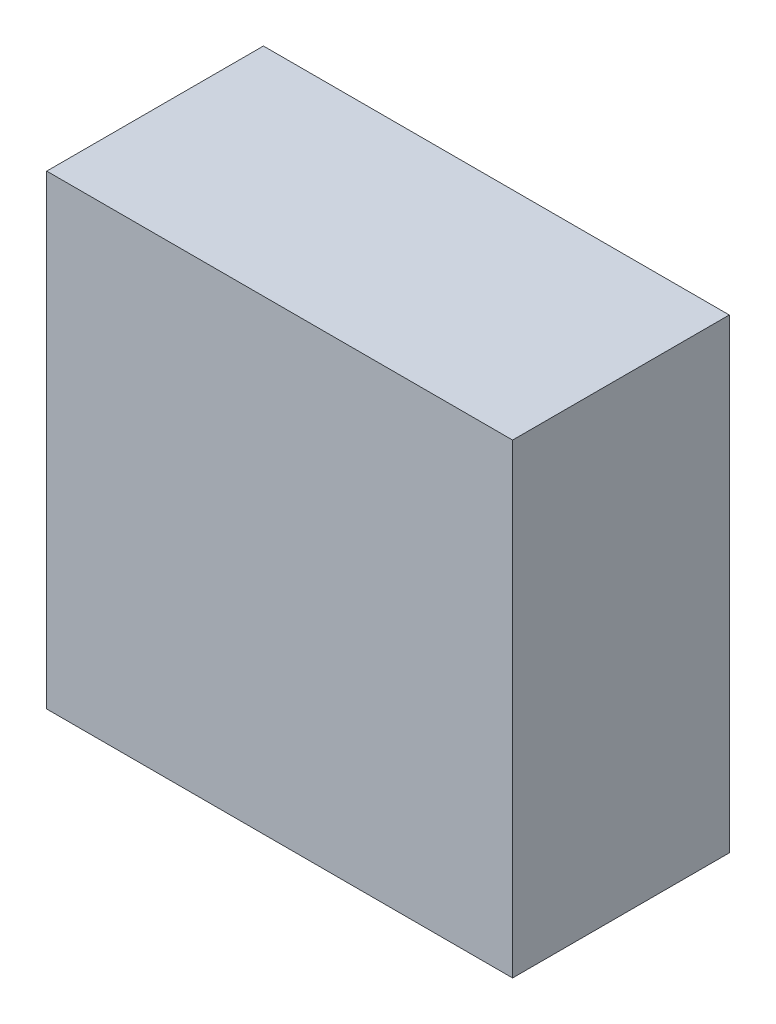
ISO-10303-21;
HEADER;
FILE_DESCRIPTION(('STEP AP214'),'2;1');
FILE_NAME('part.step','',(''),(''),'','','');
FILE_SCHEMA(('AUTOMOTIVE_DESIGN { 1 0 10303 214 1 1 1 1 }'));
ENDSEC;
DATA;
#1=APPLICATION_CONTEXT('core data for automotive mechanical design processes');
#2=APPLICATION_PROTOCOL_DEFINITION('international standard','automotive_design',2000,#1);
#3=PRODUCT_CONTEXT('',#1,'mechanical');
#4=PRODUCT('Part','Part','',(#3));
#5=PRODUCT_RELATED_PRODUCT_CATEGORY('part','',(#4));
#6=PRODUCT_DEFINITION_FORMATION('','',#4);
#7=PRODUCT_DEFINITION_CONTEXT('part definition',#1,'design');
#8=PRODUCT_DEFINITION('design','',#6,#7);
#9=PRODUCT_DEFINITION_SHAPE('','',#8);
#10=(LENGTH_UNIT() NAMED_UNIT(*) SI_UNIT(.MILLI.,.METRE.));
#11=(NAMED_UNIT(*) PLANE_ANGLE_UNIT() SI_UNIT($,.RADIAN.));
#12=(NAMED_UNIT(*) SI_UNIT($,.STERADIAN.) SOLID_ANGLE_UNIT());
#13=UNCERTAINTY_MEASURE_WITH_UNIT(LENGTH_MEASURE(1.E-05),#10,'distance_accuracy_value','');
#14=(GEOMETRIC_REPRESENTATION_CONTEXT(3) GLOBAL_UNCERTAINTY_ASSIGNED_CONTEXT((#13)) GLOBAL_UNIT_ASSIGNED_CONTEXT((#10,
#11,#12)) REPRESENTATION_CONTEXT('',''));
#15=CARTESIAN_POINT('',(0.,0.,0.));
#16=DIRECTION('',(0.,0.,1.));
#17=DIRECTION('',(1.,0.,0.));
#18=AXIS2_PLACEMENT_3D('',#15,#16,#17);
#19=CARTESIAN_POINT('',(-21.5,-21.5,20.));
#20=DIRECTION('',(1.,0.,0.));
#21=DIRECTION('',(0.,0.,-1.));
#22=AXIS2_PLACEMENT_3D('',#19,#20,#21);
#23=PLANE('',#22);
#24=DIRECTION('',(0.,-1.,0.));
#25=VECTOR('',#24,1.);
#26=CARTESIAN_POINT('',(-21.5,-21.5,0.));
#27=LINE('',#26,#25);
#28=CARTESIAN_POINT('',(-21.5,21.5,0.));
#29=VERTEX_POINT('',#28);
#30=CARTESIAN_POINT('',(-21.5,-21.5,0.));
#31=VERTEX_POINT('',#30);
#32=EDGE_CURVE('E96',#29,#31,#27,.T.);
#33=ORIENTED_EDGE('',*,*,#32,.T.);
#34=DIRECTION('',(0.,0.,-1.));
#35=VECTOR('',#34,1.);
#36=CARTESIAN_POINT('',(-21.5,-21.5,20.));
#37=LINE('',#36,#35);
#38=CARTESIAN_POINT('',(-21.5,-21.5,20.));
#39=VERTEX_POINT('',#38);
#40=EDGE_CURVE('E11',#39,#31,#37,.T.);
#41=ORIENTED_EDGE('',*,*,#40,.F.);
#42=DIRECTION('',(0.,-1.,0.));
#43=VECTOR('',#42,1.);
#44=CARTESIAN_POINT('',(-21.5,-21.5,20.));
#45=LINE('',#44,#43);
#46=CARTESIAN_POINT('',(-21.5,21.5,20.));
#47=VERTEX_POINT('',#46);
#48=EDGE_CURVE('E84',#47,#39,#45,.T.);
#49=ORIENTED_EDGE('',*,*,#48,.F.);
#50=DIRECTION('',(0.,0.,-1.));
#51=VECTOR('',#50,1.);
#52=CARTESIAN_POINT('',(-21.5,21.5,20.));
#53=LINE('',#52,#51);
#54=EDGE_CURVE('E92',#47,#29,#53,.T.);
#55=ORIENTED_EDGE('',*,*,#54,.T.);
#56=EDGE_LOOP('',(#33,#41,#49,#55));
#57=FACE_BOUND('',#56,.T.);
#58=ADVANCED_FACE('F33',(#57),#23,.F.);
#59=CARTESIAN_POINT('',(21.5,-21.5,20.));
#60=DIRECTION('',(0.,1.,0.));
#61=DIRECTION('',(-1.,0.,0.));
#62=AXIS2_PLACEMENT_3D('',#59,#60,#61);
#63=PLANE('',#62);
#64=DIRECTION('',(1.,0.,0.));
#65=VECTOR('',#64,1.);
#66=CARTESIAN_POINT('',(21.5,-21.5,0.));
#67=LINE('',#66,#65);
#68=CARTESIAN_POINT('',(21.5,-21.5,0.));
#69=VERTEX_POINT('',#68);
#70=EDGE_CURVE('E88',#31,#69,#67,.T.);
#71=ORIENTED_EDGE('',*,*,#70,.T.);
#72=DIRECTION('',(0.,0.,-1.));
#73=VECTOR('',#72,1.);
#74=CARTESIAN_POINT('',(21.5,-21.5,20.));
#75=LINE('',#74,#73);
#76=CARTESIAN_POINT('',(21.5,-21.5,20.));
#77=VERTEX_POINT('',#76);
#78=EDGE_CURVE('E41',#77,#69,#75,.T.);
#79=ORIENTED_EDGE('',*,*,#78,.F.);
#80=DIRECTION('',(1.,0.,0.));
#81=VECTOR('',#80,1.);
#82=CARTESIAN_POINT('',(21.5,-21.5,20.));
#83=LINE('',#82,#81);
#84=EDGE_CURVE('E79',#39,#77,#83,.T.);
#85=ORIENTED_EDGE('',*,*,#84,.F.);
#86=ORIENTED_EDGE('',*,*,#40,.T.);
#87=EDGE_LOOP('',(#71,#79,#85,#86));
#88=FACE_BOUND('',#87,.T.);
#89=ADVANCED_FACE('F87',(#88),#63,.F.);
#90=CARTESIAN_POINT('',(21.5,-21.5,20.));
#91=DIRECTION('',(-1.,0.,0.));
#92=DIRECTION('',(0.,0.,1.));
#93=AXIS2_PLACEMENT_3D('',#90,#91,#92);
#94=PLANE('',#93);
#95=DIRECTION('',(0.,1.,0.));
#96=VECTOR('',#95,1.);
#97=CARTESIAN_POINT('',(21.5,-21.5,0.));
#98=LINE('',#97,#96);
#99=CARTESIAN_POINT('',(21.5,21.5,0.));
#100=VERTEX_POINT('',#99);
#101=EDGE_CURVE('E66',#69,#100,#98,.T.);
#102=ORIENTED_EDGE('',*,*,#101,.T.);
#103=DIRECTION('',(0.,0.,-1.));
#104=VECTOR('',#103,1.);
#105=CARTESIAN_POINT('',(21.5,21.5,20.));
#106=LINE('',#105,#104);
#107=CARTESIAN_POINT('',(21.5,21.5,20.));
#108=VERTEX_POINT('',#107);
#109=EDGE_CURVE('E89',#108,#100,#106,.T.);
#110=ORIENTED_EDGE('',*,*,#109,.F.);
#111=DIRECTION('',(0.,1.,0.));
#112=VECTOR('',#111,1.);
#113=CARTESIAN_POINT('',(21.5,-21.5,20.));
#114=LINE('',#113,#112);
#115=EDGE_CURVE('E82',#77,#108,#114,.T.);
#116=ORIENTED_EDGE('',*,*,#115,.F.);
#117=ORIENTED_EDGE('',*,*,#78,.T.);
#118=EDGE_LOOP('',(#102,#110,#116,#117));
#119=FACE_BOUND('',#118,.T.);
#120=ADVANCED_FACE('F90',(#119),#94,.F.);
#121=CARTESIAN_POINT('',(21.5,21.5,20.));
#122=DIRECTION('',(0.,-1.,0.));
#123=DIRECTION('',(1.,0.,0.));
#124=AXIS2_PLACEMENT_3D('',#121,#122,#123);
#125=PLANE('',#124);
#126=DIRECTION('',(-1.,0.,0.));
#127=VECTOR('',#126,1.);
#128=CARTESIAN_POINT('',(21.5,21.5,0.));
#129=LINE('',#128,#127);
#130=EDGE_CURVE('E72',#100,#29,#129,.T.);
#131=ORIENTED_EDGE('',*,*,#130,.T.);
#132=ORIENTED_EDGE('',*,*,#54,.F.);
#133=DIRECTION('',(-1.,0.,0.));
#134=VECTOR('',#133,1.);
#135=CARTESIAN_POINT('',(21.5,21.5,20.));
#136=LINE('',#135,#134);
#137=EDGE_CURVE('E49',#108,#47,#136,.T.);
#138=ORIENTED_EDGE('',*,*,#137,.F.);
#139=ORIENTED_EDGE('',*,*,#109,.T.);
#140=EDGE_LOOP('',(#131,#132,#138,#139));
#141=FACE_BOUND('',#140,.T.);
#142=ADVANCED_FACE('F103',(#141),#125,.F.);
#143=CARTESIAN_POINT('',(0.,0.,20.));
#144=DIRECTION('',(0.,0.,1.));
#145=DIRECTION('',(1.,0.,0.));
#146=AXIS2_PLACEMENT_3D('',#143,#144,#145);
#147=PLANE('',#146);
#148=ORIENTED_EDGE('',*,*,#48,.T.);
#149=ORIENTED_EDGE('',*,*,#84,.T.);
#150=ORIENTED_EDGE('',*,*,#115,.T.);
#151=ORIENTED_EDGE('',*,*,#137,.T.);
#152=EDGE_LOOP('',(#148,#149,#150,#151));
#153=FACE_BOUND('',#152,.T.);
#154=ADVANCED_FACE('F80',(#153),#147,.T.);
#155=CARTESIAN_POINT('',(0.,0.,0.));
#156=DIRECTION('',(0.,0.,1.));
#157=DIRECTION('',(1.,0.,0.));
#158=AXIS2_PLACEMENT_3D('',#155,#156,#157);
#159=PLANE('',#158);
#160=ORIENTED_EDGE('',*,*,#32,.F.);
#161=ORIENTED_EDGE('',*,*,#130,.F.);
#162=ORIENTED_EDGE('',*,*,#101,.F.);
#163=ORIENTED_EDGE('',*,*,#70,.F.);
#164=EDGE_LOOP('',(#160,#161,#162,#163));
#165=FACE_BOUND('',#164,.T.);
#166=ADVANCED_FACE('F106',(#165),#159,.F.);
#167=CLOSED_SHELL('',(#58,#89,#120,#142,#154,#166));
#168=MANIFOLD_SOLID_BREP('B2',#167);
#169=ADVANCED_BREP_SHAPE_REPRESENTATION('',(#18,#168),#14);
#170=SHAPE_DEFINITION_REPRESENTATION(#9,#169);
ENDSEC;
END-ISO-10303-21;
